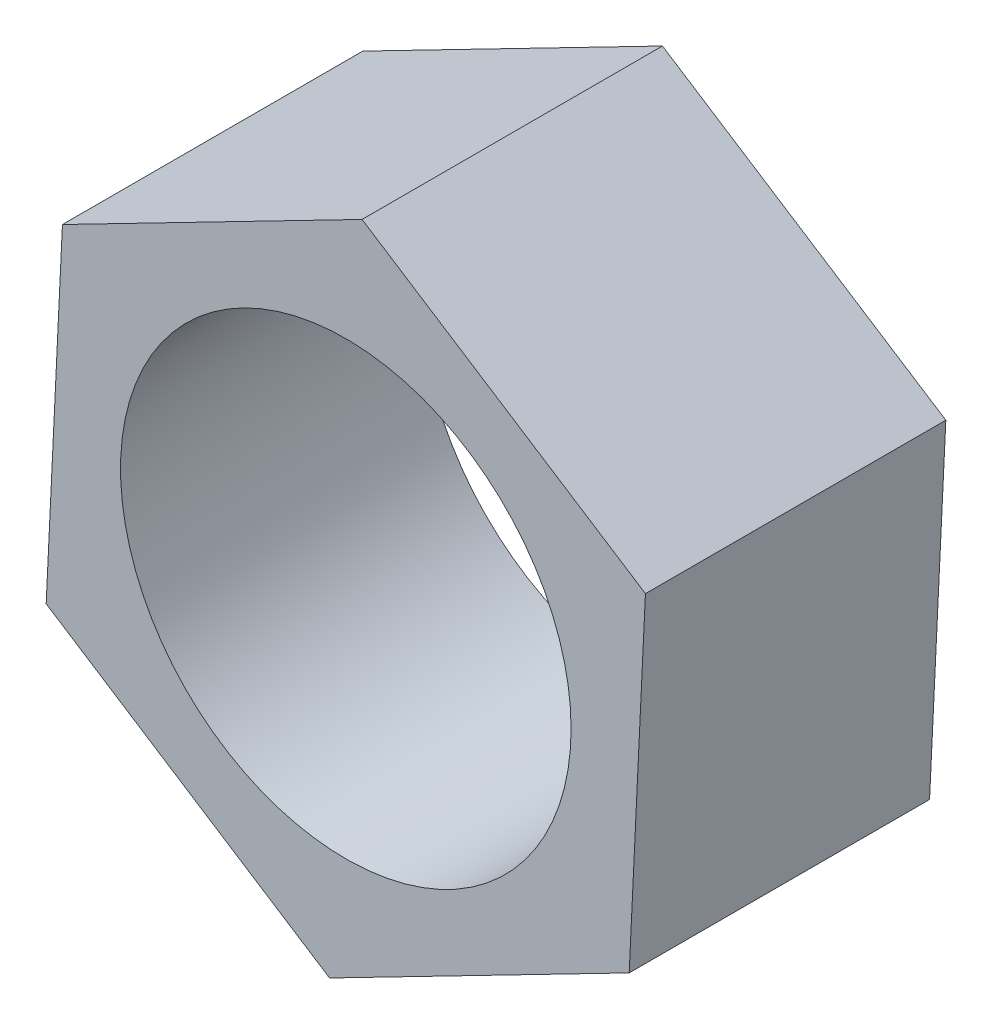
ISO-10303-21;
HEADER;
FILE_DESCRIPTION(('STEP AP214'),'2;1');
FILE_NAME('part.step','',(''),(''),'','','');
FILE_SCHEMA(('AUTOMOTIVE_DESIGN { 1 0 10303 214 1 1 1 1 }'));
ENDSEC;
DATA;
#1=APPLICATION_CONTEXT('core data for automotive mechanical design processes');
#2=APPLICATION_PROTOCOL_DEFINITION('international standard','automotive_design',2000,#1);
#3=PRODUCT_CONTEXT('',#1,'mechanical');
#4=PRODUCT('Part','Part','',(#3));
#5=PRODUCT_RELATED_PRODUCT_CATEGORY('part','',(#4));
#6=PRODUCT_DEFINITION_FORMATION('','',#4);
#7=PRODUCT_DEFINITION_CONTEXT('part definition',#1,'design');
#8=PRODUCT_DEFINITION('design','',#6,#7);
#9=PRODUCT_DEFINITION_SHAPE('','',#8);
#10=(LENGTH_UNIT() NAMED_UNIT(*) SI_UNIT(.MILLI.,.METRE.));
#11=(NAMED_UNIT(*) PLANE_ANGLE_UNIT() SI_UNIT($,.RADIAN.));
#12=(NAMED_UNIT(*) SI_UNIT($,.STERADIAN.) SOLID_ANGLE_UNIT());
#13=UNCERTAINTY_MEASURE_WITH_UNIT(LENGTH_MEASURE(1.E-05),#10,'distance_accuracy_value','');
#14=(GEOMETRIC_REPRESENTATION_CONTEXT(3) GLOBAL_UNCERTAINTY_ASSIGNED_CONTEXT((#13)) GLOBAL_UNIT_ASSIGNED_CONTEXT((#10,
#11,#12)) REPRESENTATION_CONTEXT('',''));
#15=CARTESIAN_POINT('',(0.,0.,0.));
#16=DIRECTION('',(0.,0.,1.));
#17=DIRECTION('',(1.,0.,0.));
#18=AXIS2_PLACEMENT_3D('',#15,#16,#17);
#19=CARTESIAN_POINT('',(0.,0.,4.));
#20=DIRECTION('',(0.,0.,1.));
#21=DIRECTION('',(1.,0.,0.));
#22=AXIS2_PLACEMENT_3D('',#19,#20,#21);
#23=PLANE('',#22);
#24=DIRECTION('',(-0.840897571529274,0.541194303551108,0.));
#25=VECTOR('',#24,1.);
#26=CARTESIAN_POINT('',(3.98999495099516,2.05366294679347,4.));
#27=LINE('',#26,#25);
#28=CARTESIAN_POINT('',(3.98999495099516,2.05366294679347,4.));
#29=VERTEX_POINT('',#28);
#30=CARTESIAN_POINT('',(0.216473192763624,4.48226846193019,4.));
#31=VERTEX_POINT('',#30);
#32=EDGE_CURVE('E129',#29,#31,#27,.T.);
#33=ORIENTED_EDGE('',*,*,#32,.T.);
#34=DIRECTION('',(-0.889136801023324,-0.457641507149439,0.));
#35=VECTOR('',#34,1.);
#36=CARTESIAN_POINT('',(0.216473192763624,4.48226846193019,4.));
#37=LINE('',#36,#35);
#38=CARTESIAN_POINT('',(-3.77352175823153,2.42860551513672,4.));
#39=VERTEX_POINT('',#38);
#40=EDGE_CURVE('E87',#31,#39,#37,.T.);
#41=ORIENTED_EDGE('',*,*,#40,.T.);
#42=DIRECTION('',(-0.048239229494049,-0.998835810700548,0.));
#43=VECTOR('',#42,1.);
#44=CARTESIAN_POINT('',(-3.77352175823153,2.42860551513672,4.));
#45=LINE('',#44,#43);
#46=CARTESIAN_POINT('',(-3.98999495099515,-2.05366294679347,4.));
#47=VERTEX_POINT('',#46);
#48=EDGE_CURVE('E100',#39,#47,#45,.T.);
#49=ORIENTED_EDGE('',*,*,#48,.T.);
#50=DIRECTION('',(0.840897571529274,-0.541194303551108,0.));
#51=VECTOR('',#50,1.);
#52=CARTESIAN_POINT('',(-3.98999495099515,-2.05366294679347,4.));
#53=LINE('',#52,#51);
#54=CARTESIAN_POINT('',(-0.216473192763621,-4.48226846193019,4.));
#55=VERTEX_POINT('',#54);
#56=EDGE_CURVE('E94',#47,#55,#53,.T.);
#57=ORIENTED_EDGE('',*,*,#56,.T.);
#58=DIRECTION('',(0.889136801023324,0.457641507149439,0.));
#59=VECTOR('',#58,1.);
#60=CARTESIAN_POINT('',(-0.216473192763621,-4.48226846193019,4.));
#61=LINE('',#60,#59);
#62=CARTESIAN_POINT('',(3.77352175823153,-2.42860551513672,4.));
#63=VERTEX_POINT('',#62);
#64=EDGE_CURVE('E98',#55,#63,#61,.T.);
#65=ORIENTED_EDGE('',*,*,#64,.T.);
#66=DIRECTION('',(0.0482392294940492,0.998835810700548,0.));
#67=VECTOR('',#66,1.);
#68=CARTESIAN_POINT('',(3.77352175823153,-2.42860551513672,4.));
#69=LINE('',#68,#67);
#70=EDGE_CURVE('E50',#63,#29,#69,.T.);
#71=ORIENTED_EDGE('',*,*,#70,.T.);
#72=EDGE_LOOP('',(#33,#41,#49,#57,#65,#71));
#73=FACE_BOUND('',#72,.T.);
#74=CARTESIAN_POINT('',(0.,0.,4.));
#75=DIRECTION('',(0.,0.,1.));
#76=DIRECTION('',(1.,0.,0.));
#77=AXIS2_PLACEMENT_3D('',#74,#75,#76);
#78=CIRCLE('',#77,3.);
#79=CARTESIAN_POINT('',(3.,0.,4.));
#80=VERTEX_POINT('',#79);
#81=EDGE_CURVE('E122',#80,#80,#78,.T.);
#82=ORIENTED_EDGE('',*,*,#81,.F.);
#83=EDGE_LOOP('',(#82));
#84=FACE_BOUND('',#83,.T.);
#85=ADVANCED_FACE('F33',(#73,#84),#23,.T.);
#86=CARTESIAN_POINT('',(0.,0.,0.));
#87=DIRECTION('',(0.,0.,1.));
#88=DIRECTION('',(1.,0.,0.));
#89=AXIS2_PLACEMENT_3D('',#86,#87,#88);
#90=PLANE('',#89);
#91=DIRECTION('',(-0.840897571529274,0.541194303551108,0.));
#92=VECTOR('',#91,1.);
#93=CARTESIAN_POINT('',(3.98999495099516,2.05366294679347,0.));
#94=LINE('',#93,#92);
#95=CARTESIAN_POINT('',(3.98999495099516,2.05366294679347,0.));
#96=VERTEX_POINT('',#95);
#97=CARTESIAN_POINT('',(0.216473192763624,4.48226846193019,0.));
#98=VERTEX_POINT('',#97);
#99=EDGE_CURVE('E118',#96,#98,#94,.T.);
#100=ORIENTED_EDGE('',*,*,#99,.F.);
#101=DIRECTION('',(0.0482392294940492,0.998835810700548,0.));
#102=VECTOR('',#101,1.);
#103=CARTESIAN_POINT('',(3.77352175823153,-2.42860551513672,0.));
#104=LINE('',#103,#102);
#105=CARTESIAN_POINT('',(3.77352175823153,-2.42860551513672,0.));
#106=VERTEX_POINT('',#105);
#107=EDGE_CURVE('E79',#106,#96,#104,.T.);
#108=ORIENTED_EDGE('',*,*,#107,.F.);
#109=DIRECTION('',(0.889136801023324,0.457641507149439,0.));
#110=VECTOR('',#109,1.);
#111=CARTESIAN_POINT('',(-0.216473192763621,-4.48226846193019,0.));
#112=LINE('',#111,#110);
#113=CARTESIAN_POINT('',(-0.216473192763621,-4.48226846193019,0.));
#114=VERTEX_POINT('',#113);
#115=EDGE_CURVE('E73',#114,#106,#112,.T.);
#116=ORIENTED_EDGE('',*,*,#115,.F.);
#117=DIRECTION('',(0.840897571529274,-0.541194303551108,0.));
#118=VECTOR('',#117,1.);
#119=CARTESIAN_POINT('',(-3.98999495099515,-2.05366294679347,0.));
#120=LINE('',#119,#118);
#121=CARTESIAN_POINT('',(-3.98999495099515,-2.05366294679347,0.));
#122=VERTEX_POINT('',#121);
#123=EDGE_CURVE('E108',#122,#114,#120,.T.);
#124=ORIENTED_EDGE('',*,*,#123,.F.);
#125=DIRECTION('',(-0.048239229494049,-0.998835810700548,0.));
#126=VECTOR('',#125,1.);
#127=CARTESIAN_POINT('',(-3.77352175823153,2.42860551513672,0.));
#128=LINE('',#127,#126);
#129=CARTESIAN_POINT('',(-3.77352175823153,2.42860551513672,0.));
#130=VERTEX_POINT('',#129);
#131=EDGE_CURVE('E124',#130,#122,#128,.T.);
#132=ORIENTED_EDGE('',*,*,#131,.F.);
#133=DIRECTION('',(-0.889136801023324,-0.457641507149439,0.));
#134=VECTOR('',#133,1.);
#135=CARTESIAN_POINT('',(0.216473192763624,4.48226846193019,0.));
#136=LINE('',#135,#134);
#137=EDGE_CURVE('E121',#98,#130,#136,.T.);
#138=ORIENTED_EDGE('',*,*,#137,.F.);
#139=EDGE_LOOP('',(#100,#108,#116,#124,#132,#138));
#140=FACE_BOUND('',#139,.T.);
#141=CARTESIAN_POINT('',(0.,0.,0.));
#142=DIRECTION('',(0.,0.,1.));
#143=DIRECTION('',(1.,0.,0.));
#144=AXIS2_PLACEMENT_3D('',#141,#142,#143);
#145=CIRCLE('',#144,3.);
#146=CARTESIAN_POINT('',(3.,0.,0.));
#147=VERTEX_POINT('',#146);
#148=EDGE_CURVE('E222',#147,#147,#145,.T.);
#149=ORIENTED_EDGE('',*,*,#148,.T.);
#150=EDGE_LOOP('',(#149));
#151=FACE_BOUND('',#150,.T.);
#152=ADVANCED_FACE('F138',(#140,#151),#90,.F.);
#153=CARTESIAN_POINT('',(3.98999495099516,2.05366294679347,4.));
#154=DIRECTION('',(-0.541194303551108,-0.840897571529274,0.));
#155=DIRECTION('',(0.840897571529274,-0.541194303551108,0.));
#156=AXIS2_PLACEMENT_3D('',#153,#154,#155);
#157=PLANE('',#156);
#158=ORIENTED_EDGE('',*,*,#99,.T.);
#159=DIRECTION('',(0.,0.,-1.));
#160=VECTOR('',#159,1.);
#161=CARTESIAN_POINT('',(0.216473192763624,4.48226846193019,4.));
#162=LINE('',#161,#160);
#163=EDGE_CURVE('E11',#31,#98,#162,.T.);
#164=ORIENTED_EDGE('',*,*,#163,.F.);
#165=ORIENTED_EDGE('',*,*,#32,.F.);
#166=DIRECTION('',(0.,0.,-1.));
#167=VECTOR('',#166,1.);
#168=CARTESIAN_POINT('',(3.98999495099516,2.05366294679347,4.));
#169=LINE('',#168,#167);
#170=EDGE_CURVE('E114',#29,#96,#169,.T.);
#171=ORIENTED_EDGE('',*,*,#170,.T.);
#172=EDGE_LOOP('',(#158,#164,#165,#171));
#173=FACE_BOUND('',#172,.T.);
#174=ADVANCED_FACE('F35',(#173),#157,.F.);
#175=CARTESIAN_POINT('',(0.216473192763624,4.48226846193019,4.));
#176=DIRECTION('',(0.457641507149439,-0.889136801023324,0.));
#177=DIRECTION('',(0.889136801023324,0.457641507149439,0.));
#178=AXIS2_PLACEMENT_3D('',#175,#176,#177);
#179=PLANE('',#178);
#180=ORIENTED_EDGE('',*,*,#137,.T.);
#181=DIRECTION('',(0.,0.,-1.));
#182=VECTOR('',#181,1.);
#183=CARTESIAN_POINT('',(-3.77352175823153,2.42860551513672,4.));
#184=LINE('',#183,#182);
#185=EDGE_CURVE('E42',#39,#130,#184,.T.);
#186=ORIENTED_EDGE('',*,*,#185,.F.);
#187=ORIENTED_EDGE('',*,*,#40,.F.);
#188=ORIENTED_EDGE('',*,*,#163,.T.);
#189=EDGE_LOOP('',(#180,#186,#187,#188));
#190=FACE_BOUND('',#189,.T.);
#191=ADVANCED_FACE('F163',(#190),#179,.F.);
#192=CARTESIAN_POINT('',(-3.77352175823153,2.42860551513672,4.));
#193=DIRECTION('',(0.998835810700548,-0.048239229494049,0.));
#194=DIRECTION('',(0.048239229494049,0.998835810700548,0.));
#195=AXIS2_PLACEMENT_3D('',#192,#193,#194);
#196=PLANE('',#195);
#197=ORIENTED_EDGE('',*,*,#131,.T.);
#198=DIRECTION('',(0.,0.,-1.));
#199=VECTOR('',#198,1.);
#200=CARTESIAN_POINT('',(-3.98999495099515,-2.05366294679347,4.));
#201=LINE('',#200,#199);
#202=EDGE_CURVE('E109',#47,#122,#201,.T.);
#203=ORIENTED_EDGE('',*,*,#202,.F.);
#204=ORIENTED_EDGE('',*,*,#48,.F.);
#205=ORIENTED_EDGE('',*,*,#185,.T.);
#206=EDGE_LOOP('',(#197,#203,#204,#205));
#207=FACE_BOUND('',#206,.T.);
#208=ADVANCED_FACE('F135',(#207),#196,.F.);
#209=CARTESIAN_POINT('',(-3.98999495099515,-2.05366294679347,4.));
#210=DIRECTION('',(0.541194303551108,0.840897571529274,0.));
#211=DIRECTION('',(-0.840897571529274,0.541194303551108,0.));
#212=AXIS2_PLACEMENT_3D('',#209,#210,#211);
#213=PLANE('',#212);
#214=ORIENTED_EDGE('',*,*,#123,.T.);
#215=DIRECTION('',(0.,0.,-1.));
#216=VECTOR('',#215,1.);
#217=CARTESIAN_POINT('',(-0.216473192763621,-4.48226846193019,4.));
#218=LINE('',#217,#216);
#219=EDGE_CURVE('E105',#55,#114,#218,.T.);
#220=ORIENTED_EDGE('',*,*,#219,.F.);
#221=ORIENTED_EDGE('',*,*,#56,.F.);
#222=ORIENTED_EDGE('',*,*,#202,.T.);
#223=EDGE_LOOP('',(#214,#220,#221,#222));
#224=FACE_BOUND('',#223,.T.);
#225=ADVANCED_FACE('F106',(#224),#213,.F.);
#226=CARTESIAN_POINT('',(-0.216473192763621,-4.48226846193019,4.));
#227=DIRECTION('',(-0.457641507149439,0.889136801023324,0.));
#228=DIRECTION('',(-0.889136801023324,-0.457641507149439,0.));
#229=AXIS2_PLACEMENT_3D('',#226,#227,#228);
#230=PLANE('',#229);
#231=ORIENTED_EDGE('',*,*,#115,.T.);
#232=DIRECTION('',(0.,0.,-1.));
#233=VECTOR('',#232,1.);
#234=CARTESIAN_POINT('',(3.77352175823153,-2.42860551513672,4.));
#235=LINE('',#234,#233);
#236=EDGE_CURVE('E110',#63,#106,#235,.T.);
#237=ORIENTED_EDGE('',*,*,#236,.F.);
#238=ORIENTED_EDGE('',*,*,#64,.F.);
#239=ORIENTED_EDGE('',*,*,#219,.T.);
#240=EDGE_LOOP('',(#231,#237,#238,#239));
#241=FACE_BOUND('',#240,.T.);
#242=ADVANCED_FACE('F112',(#241),#230,.F.);
#243=CARTESIAN_POINT('',(3.77352175823153,-2.42860551513672,4.));
#244=DIRECTION('',(-0.998835810700548,0.0482392294940492,0.));
#245=DIRECTION('',(-0.0482392294940492,-0.998835810700548,0.));
#246=AXIS2_PLACEMENT_3D('',#243,#244,#245);
#247=PLANE('',#246);
#248=ORIENTED_EDGE('',*,*,#107,.T.);
#249=ORIENTED_EDGE('',*,*,#170,.F.);
#250=ORIENTED_EDGE('',*,*,#70,.F.);
#251=ORIENTED_EDGE('',*,*,#236,.T.);
#252=EDGE_LOOP('',(#248,#249,#250,#251));
#253=FACE_BOUND('',#252,.T.);
#254=ADVANCED_FACE('F143',(#253),#247,.F.);
#255=CARTESIAN_POINT('',(0.,0.,4.));
#256=DIRECTION('',(0.,0.,-1.));
#257=DIRECTION('',(-1.,0.,0.));
#258=AXIS2_PLACEMENT_3D('',#255,#256,#257);
#259=CYLINDRICAL_SURFACE('',#258,3.);
#260=ORIENTED_EDGE('',*,*,#81,.T.);
#261=EDGE_LOOP('',(#260));
#262=FACE_BOUND('',#261,.T.);
#263=ORIENTED_EDGE('',*,*,#148,.F.);
#264=EDGE_LOOP('',(#263));
#265=FACE_BOUND('',#264,.T.);
#266=ADVANCED_FACE('F145',(#262,#265),#259,.F.);
#267=CLOSED_SHELL('',(#85,#152,#174,#191,#208,#225,#242,#254,#266));
#268=MANIFOLD_SOLID_BREP('B2',#267);
#269=ADVANCED_BREP_SHAPE_REPRESENTATION('',(#18,#268),#14);
#270=SHAPE_DEFINITION_REPRESENTATION(#9,#269);
ENDSEC;
END-ISO-10303-21;
